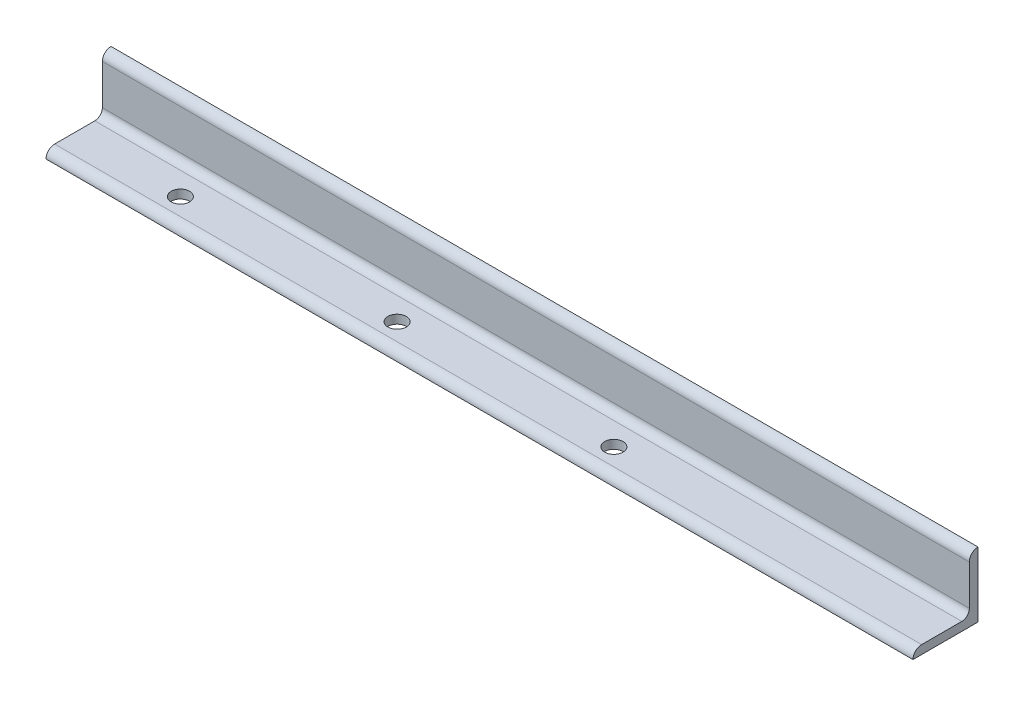
ISO-10303-21;
HEADER;
FILE_DESCRIPTION(('STEP AP214'),'2;1');
FILE_NAME('part.step','',(''),(''),'','','');
FILE_SCHEMA(('AUTOMOTIVE_DESIGN { 1 0 10303 214 1 1 1 1 }'));
ENDSEC;
DATA;
#1=APPLICATION_CONTEXT('core data for automotive mechanical design processes');
#2=APPLICATION_PROTOCOL_DEFINITION('international standard','automotive_design',2000,#1);
#3=PRODUCT_CONTEXT('',#1,'mechanical');
#4=PRODUCT('Part','Part','',(#3));
#5=PRODUCT_RELATED_PRODUCT_CATEGORY('part','',(#4));
#6=PRODUCT_DEFINITION_FORMATION('','',#4);
#7=PRODUCT_DEFINITION_CONTEXT('part definition',#1,'design');
#8=PRODUCT_DEFINITION('design','',#6,#7);
#9=PRODUCT_DEFINITION_SHAPE('','',#8);
#10=(LENGTH_UNIT() NAMED_UNIT(*) SI_UNIT(.MILLI.,.METRE.));
#11=(NAMED_UNIT(*) PLANE_ANGLE_UNIT() SI_UNIT($,.RADIAN.));
#12=(NAMED_UNIT(*) SI_UNIT($,.STERADIAN.) SOLID_ANGLE_UNIT());
#13=UNCERTAINTY_MEASURE_WITH_UNIT(LENGTH_MEASURE(1.E-05),#10,'distance_accuracy_value','');
#14=(GEOMETRIC_REPRESENTATION_CONTEXT(3) GLOBAL_UNCERTAINTY_ASSIGNED_CONTEXT((#13)) GLOBAL_UNIT_ASSIGNED_CONTEXT((#10,
#11,#12)) REPRESENTATION_CONTEXT('',''));
#15=CARTESIAN_POINT('',(0.,0.,0.));
#16=DIRECTION('',(0.,0.,1.));
#17=DIRECTION('',(1.,0.,0.));
#18=AXIS2_PLACEMENT_3D('',#15,#16,#17);
#19=CARTESIAN_POINT('',(400.,30.,0.));
#20=DIRECTION('',(0.,0.,1.));
#21=DIRECTION('',(1.,0.,0.));
#22=AXIS2_PLACEMENT_3D('',#19,#20,#21);
#23=PLANE('',#22);
#24=DIRECTION('',(0.,1.,0.));
#25=VECTOR('',#24,1.);
#26=CARTESIAN_POINT('',(0.,30.,0.));
#27=LINE('',#26,#25);
#28=CARTESIAN_POINT('',(0.,0.,0.));
#29=VERTEX_POINT('',#28);
#30=CARTESIAN_POINT('',(0.,30.,0.));
#31=VERTEX_POINT('',#30);
#32=EDGE_CURVE('E151',#29,#31,#27,.T.);
#33=ORIENTED_EDGE('',*,*,#32,.T.);
#34=DIRECTION('',(-1.,0.,0.));
#35=VECTOR('',#34,1.);
#36=CARTESIAN_POINT('',(400.,30.,0.));
#37=LINE('',#36,#35);
#38=CARTESIAN_POINT('',(400.,30.,0.));
#39=VERTEX_POINT('',#38);
#40=EDGE_CURVE('E13',#39,#31,#37,.T.);
#41=ORIENTED_EDGE('',*,*,#40,.F.);
#42=DIRECTION('',(0.,1.,0.));
#43=VECTOR('',#42,1.);
#44=CARTESIAN_POINT('',(400.,30.,0.));
#45=LINE('',#44,#43);
#46=CARTESIAN_POINT('',(400.,0.,0.));
#47=VERTEX_POINT('',#46);
#48=EDGE_CURVE('E163',#47,#39,#45,.T.);
#49=ORIENTED_EDGE('',*,*,#48,.F.);
#50=DIRECTION('',(-1.,0.,0.));
#51=VECTOR('',#50,1.);
#52=CARTESIAN_POINT('',(400.,0.,0.));
#53=LINE('',#52,#51);
#54=EDGE_CURVE('E147',#47,#29,#53,.T.);
#55=ORIENTED_EDGE('',*,*,#54,.T.);
#56=EDGE_LOOP('',(#33,#41,#49,#55));
#57=FACE_BOUND('',#56,.T.);
#58=ADVANCED_FACE('F59',(#57),#23,.F.);
#59=CARTESIAN_POINT('',(400.,26.,0.));
#60=DIRECTION('',(-1.,0.,0.));
#61=DIRECTION('',(0.,0.,1.));
#62=AXIS2_PLACEMENT_3D('',#59,#60,#61);
#63=CYLINDRICAL_SURFACE('',#62,4.);
#64=CARTESIAN_POINT('',(0.,26.,0.));
#65=DIRECTION('',(1.,0.,0.));
#66=DIRECTION('',(0.,0.,-1.));
#67=AXIS2_PLACEMENT_3D('',#64,#65,#66);
#68=CIRCLE('',#67,4.);
#69=CARTESIAN_POINT('',(0.,26.,4.));
#70=VERTEX_POINT('',#69);
#71=EDGE_CURVE('E154',#31,#70,#68,.T.);
#72=ORIENTED_EDGE('',*,*,#71,.T.);
#73=DIRECTION('',(-1.,0.,0.));
#74=VECTOR('',#73,1.);
#75=CARTESIAN_POINT('',(400.,26.,4.));
#76=LINE('',#75,#74);
#77=CARTESIAN_POINT('',(400.,26.,4.));
#78=VERTEX_POINT('',#77);
#79=EDGE_CURVE('E68',#78,#70,#76,.T.);
#80=ORIENTED_EDGE('',*,*,#79,.F.);
#81=CARTESIAN_POINT('',(400.,26.,0.));
#82=DIRECTION('',(1.,0.,0.));
#83=DIRECTION('',(0.,0.,-1.));
#84=AXIS2_PLACEMENT_3D('',#81,#82,#83);
#85=CIRCLE('',#84,4.);
#86=EDGE_CURVE('E117',#39,#78,#85,.T.);
#87=ORIENTED_EDGE('',*,*,#86,.F.);
#88=ORIENTED_EDGE('',*,*,#40,.T.);
#89=EDGE_LOOP('',(#72,#80,#87,#88));
#90=FACE_BOUND('',#89,.T.);
#91=ADVANCED_FACE('F198',(#90),#63,.T.);
#92=CARTESIAN_POINT('',(400.,7.5,4.));
#93=DIRECTION('',(0.,0.,-1.));
#94=DIRECTION('',(0.,1.,0.));
#95=AXIS2_PLACEMENT_3D('',#92,#93,#94);
#96=PLANE('',#95);
#97=DIRECTION('',(0.,-1.,0.));
#98=VECTOR('',#97,1.);
#99=CARTESIAN_POINT('',(0.,7.5,4.));
#100=LINE('',#99,#98);
#101=CARTESIAN_POINT('',(0.,7.5,4.));
#102=VERTEX_POINT('',#101);
#103=EDGE_CURVE('E156',#70,#102,#100,.T.);
#104=ORIENTED_EDGE('',*,*,#103,.T.);
#105=DIRECTION('',(-1.,0.,0.));
#106=VECTOR('',#105,1.);
#107=CARTESIAN_POINT('',(400.,7.5,4.));
#108=LINE('',#107,#106);
#109=CARTESIAN_POINT('',(400.,7.5,4.));
#110=VERTEX_POINT('',#109);
#111=EDGE_CURVE('E167',#110,#102,#108,.T.);
#112=ORIENTED_EDGE('',*,*,#111,.F.);
#113=DIRECTION('',(0.,-1.,0.));
#114=VECTOR('',#113,1.);
#115=CARTESIAN_POINT('',(400.,7.5,4.));
#116=LINE('',#115,#114);
#117=EDGE_CURVE('E214',#78,#110,#116,.T.);
#118=ORIENTED_EDGE('',*,*,#117,.F.);
#119=ORIENTED_EDGE('',*,*,#79,.T.);
#120=EDGE_LOOP('',(#104,#112,#118,#119));
#121=FACE_BOUND('',#120,.T.);
#122=ADVANCED_FACE('F203',(#121),#96,.F.);
#123=CARTESIAN_POINT('',(400.,7.5,7.5));
#124=DIRECTION('',(-1.,0.,0.));
#125=DIRECTION('',(0.,0.,1.));
#126=AXIS2_PLACEMENT_3D('',#123,#124,#125);
#127=CYLINDRICAL_SURFACE('',#126,3.5);
#128=CARTESIAN_POINT('',(0.,7.5,7.5));
#129=DIRECTION('',(-1.,0.,0.));
#130=DIRECTION('',(0.,0.,1.));
#131=AXIS2_PLACEMENT_3D('',#128,#129,#130);
#132=CIRCLE('',#131,3.5);
#133=CARTESIAN_POINT('',(0.,4.,7.5));
#134=VERTEX_POINT('',#133);
#135=EDGE_CURVE('E158',#102,#134,#132,.T.);
#136=ORIENTED_EDGE('',*,*,#135,.T.);
#137=DIRECTION('',(-1.,0.,0.));
#138=VECTOR('',#137,1.);
#139=CARTESIAN_POINT('',(400.,4.,7.5));
#140=LINE('',#139,#138);
#141=CARTESIAN_POINT('',(400.,4.,7.5));
#142=VERTEX_POINT('',#141);
#143=EDGE_CURVE('E142',#142,#134,#140,.T.);
#144=ORIENTED_EDGE('',*,*,#143,.F.);
#145=CARTESIAN_POINT('',(400.,7.5,7.5));
#146=DIRECTION('',(-1.,0.,0.));
#147=DIRECTION('',(0.,0.,1.));
#148=AXIS2_PLACEMENT_3D('',#145,#146,#147);
#149=CIRCLE('',#148,3.5);
#150=EDGE_CURVE('E133',#110,#142,#149,.T.);
#151=ORIENTED_EDGE('',*,*,#150,.F.);
#152=ORIENTED_EDGE('',*,*,#111,.T.);
#153=EDGE_LOOP('',(#136,#144,#151,#152));
#154=FACE_BOUND('',#153,.T.);
#155=ADVANCED_FACE('F230',(#154),#127,.F.);
#156=CARTESIAN_POINT('',(400.,4.,26.));
#157=DIRECTION('',(0.,-1.,0.));
#158=DIRECTION('',(0.,0.,-1.));
#159=AXIS2_PLACEMENT_3D('',#156,#157,#158);
#160=PLANE('',#159);
#161=CARTESIAN_POINT('',(250.,4.,18.));
#162=DIRECTION('',(0.,1.,0.));
#163=DIRECTION('',(0.,0.,1.));
#164=AXIS2_PLACEMENT_3D('',#161,#162,#163);
#165=CIRCLE('',#164,4.25000000000001);
#166=CARTESIAN_POINT('',(250.,4.,22.25));
#167=VERTEX_POINT('',#166);
#168=EDGE_CURVE('E222',#167,#167,#165,.T.);
#169=ORIENTED_EDGE('',*,*,#168,.F.);
#170=EDGE_LOOP('',(#169));
#171=FACE_BOUND('',#170,.T.);
#172=CARTESIAN_POINT('',(50.,4.,18.));
#173=DIRECTION('',(0.,1.,0.));
#174=DIRECTION('',(0.,0.,1.));
#175=AXIS2_PLACEMENT_3D('',#172,#173,#174);
#176=CIRCLE('',#175,4.25);
#177=CARTESIAN_POINT('',(50.,4.,22.25));
#178=VERTEX_POINT('',#177);
#179=EDGE_CURVE('E221',#178,#178,#176,.T.);
#180=ORIENTED_EDGE('',*,*,#179,.F.);
#181=EDGE_LOOP('',(#180));
#182=FACE_BOUND('',#181,.T.);
#183=CARTESIAN_POINT('',(150.,4.,18.));
#184=DIRECTION('',(0.,1.,0.));
#185=DIRECTION('',(0.,0.,1.));
#186=AXIS2_PLACEMENT_3D('',#183,#184,#185);
#187=CIRCLE('',#186,4.25);
#188=CARTESIAN_POINT('',(150.,4.,22.25));
#189=VERTEX_POINT('',#188);
#190=EDGE_CURVE('E175',#189,#189,#187,.T.);
#191=ORIENTED_EDGE('',*,*,#190,.F.);
#192=EDGE_LOOP('',(#191));
#193=FACE_BOUND('',#192,.T.);
#194=DIRECTION('',(0.,0.,1.));
#195=VECTOR('',#194,1.);
#196=CARTESIAN_POINT('',(0.,4.,26.));
#197=LINE('',#196,#195);
#198=CARTESIAN_POINT('',(0.,4.,26.));
#199=VERTEX_POINT('',#198);
#200=EDGE_CURVE('E141',#134,#199,#197,.T.);
#201=ORIENTED_EDGE('',*,*,#200,.T.);
#202=DIRECTION('',(-1.,0.,0.));
#203=VECTOR('',#202,1.);
#204=CARTESIAN_POINT('',(400.,4.,26.));
#205=LINE('',#204,#203);
#206=CARTESIAN_POINT('',(400.,4.,26.));
#207=VERTEX_POINT('',#206);
#208=EDGE_CURVE('E138',#207,#199,#205,.T.);
#209=ORIENTED_EDGE('',*,*,#208,.F.);
#210=DIRECTION('',(0.,0.,1.));
#211=VECTOR('',#210,1.);
#212=CARTESIAN_POINT('',(400.,4.,26.));
#213=LINE('',#212,#211);
#214=EDGE_CURVE('E127',#142,#207,#213,.T.);
#215=ORIENTED_EDGE('',*,*,#214,.F.);
#216=ORIENTED_EDGE('',*,*,#143,.T.);
#217=EDGE_LOOP('',(#201,#209,#215,#216));
#218=FACE_BOUND('',#217,.T.);
#219=ADVANCED_FACE('F139',(#171,#182,#193,#218),#160,.F.);
#220=CARTESIAN_POINT('',(400.,0.,26.));
#221=DIRECTION('',(-1.,0.,0.));
#222=DIRECTION('',(0.,0.,1.));
#223=AXIS2_PLACEMENT_3D('',#220,#221,#222);
#224=CYLINDRICAL_SURFACE('',#223,4.);
#225=CARTESIAN_POINT('',(0.,0.,26.));
#226=DIRECTION('',(1.,0.,0.));
#227=DIRECTION('',(0.,0.,1.));
#228=AXIS2_PLACEMENT_3D('',#225,#226,#227);
#229=CIRCLE('',#228,4.);
#230=CARTESIAN_POINT('',(0.,0.,30.));
#231=VERTEX_POINT('',#230);
#232=EDGE_CURVE('E103',#199,#231,#229,.T.);
#233=ORIENTED_EDGE('',*,*,#232,.T.);
#234=DIRECTION('',(-1.,0.,0.));
#235=VECTOR('',#234,1.);
#236=CARTESIAN_POINT('',(400.,0.,30.));
#237=LINE('',#236,#235);
#238=CARTESIAN_POINT('',(400.,0.,30.));
#239=VERTEX_POINT('',#238);
#240=EDGE_CURVE('E143',#239,#231,#237,.T.);
#241=ORIENTED_EDGE('',*,*,#240,.F.);
#242=CARTESIAN_POINT('',(400.,0.,26.));
#243=DIRECTION('',(1.,0.,0.));
#244=DIRECTION('',(0.,0.,1.));
#245=AXIS2_PLACEMENT_3D('',#242,#243,#244);
#246=CIRCLE('',#245,4.);
#247=EDGE_CURVE('E131',#207,#239,#246,.T.);
#248=ORIENTED_EDGE('',*,*,#247,.F.);
#249=ORIENTED_EDGE('',*,*,#208,.T.);
#250=EDGE_LOOP('',(#233,#241,#248,#249));
#251=FACE_BOUND('',#250,.T.);
#252=ADVANCED_FACE('F145',(#251),#224,.T.);
#253=CARTESIAN_POINT('',(400.,0.,0.));
#254=DIRECTION('',(0.,1.,0.));
#255=DIRECTION('',(0.,0.,1.));
#256=AXIS2_PLACEMENT_3D('',#253,#254,#255);
#257=PLANE('',#256);
#258=CARTESIAN_POINT('',(250.,0.,18.));
#259=DIRECTION('',(0.,1.,0.));
#260=DIRECTION('',(0.,0.,1.));
#261=AXIS2_PLACEMENT_3D('',#258,#259,#260);
#262=CIRCLE('',#261,4.25000000000001);
#263=CARTESIAN_POINT('',(250.,0.,22.25));
#264=VERTEX_POINT('',#263);
#265=EDGE_CURVE('E62',#264,#264,#262,.T.);
#266=ORIENTED_EDGE('',*,*,#265,.T.);
#267=EDGE_LOOP('',(#266));
#268=FACE_BOUND('',#267,.T.);
#269=CARTESIAN_POINT('',(50.,0.,18.));
#270=DIRECTION('',(0.,1.,0.));
#271=DIRECTION('',(0.,0.,1.));
#272=AXIS2_PLACEMENT_3D('',#269,#270,#271);
#273=CIRCLE('',#272,4.25);
#274=CARTESIAN_POINT('',(50.,0.,22.25));
#275=VERTEX_POINT('',#274);
#276=EDGE_CURVE('E174',#275,#275,#273,.T.);
#277=ORIENTED_EDGE('',*,*,#276,.T.);
#278=EDGE_LOOP('',(#277));
#279=FACE_BOUND('',#278,.T.);
#280=CARTESIAN_POINT('',(150.,0.,18.));
#281=DIRECTION('',(0.,1.,0.));
#282=DIRECTION('',(0.,0.,1.));
#283=AXIS2_PLACEMENT_3D('',#280,#281,#282);
#284=CIRCLE('',#283,4.25);
#285=CARTESIAN_POINT('',(150.,0.,22.25));
#286=VERTEX_POINT('',#285);
#287=EDGE_CURVE('E172',#286,#286,#284,.T.);
#288=ORIENTED_EDGE('',*,*,#287,.T.);
#289=EDGE_LOOP('',(#288));
#290=FACE_BOUND('',#289,.T.);
#291=DIRECTION('',(0.,0.,-1.));
#292=VECTOR('',#291,1.);
#293=CARTESIAN_POINT('',(0.,0.,0.));
#294=LINE('',#293,#292);
#295=EDGE_CURVE('E109',#231,#29,#294,.T.);
#296=ORIENTED_EDGE('',*,*,#295,.T.);
#297=ORIENTED_EDGE('',*,*,#54,.F.);
#298=DIRECTION('',(0.,0.,-1.));
#299=VECTOR('',#298,1.);
#300=CARTESIAN_POINT('',(400.,0.,0.));
#301=LINE('',#300,#299);
#302=EDGE_CURVE('E77',#239,#47,#301,.T.);
#303=ORIENTED_EDGE('',*,*,#302,.F.);
#304=ORIENTED_EDGE('',*,*,#240,.T.);
#305=EDGE_LOOP('',(#296,#297,#303,#304));
#306=FACE_BOUND('',#305,.T.);
#307=ADVANCED_FACE('F182',(#268,#279,#290,#306),#257,.F.);
#308=CARTESIAN_POINT('',(400.,0.,26.));
#309=DIRECTION('',(-1.,0.,0.));
#310=DIRECTION('',(0.,0.,1.));
#311=AXIS2_PLACEMENT_3D('',#308,#309,#310);
#312=PLANE('',#311);
#313=ORIENTED_EDGE('',*,*,#48,.T.);
#314=ORIENTED_EDGE('',*,*,#86,.T.);
#315=ORIENTED_EDGE('',*,*,#117,.T.);
#316=ORIENTED_EDGE('',*,*,#150,.T.);
#317=ORIENTED_EDGE('',*,*,#214,.T.);
#318=ORIENTED_EDGE('',*,*,#247,.T.);
#319=ORIENTED_EDGE('',*,*,#302,.T.);
#320=EDGE_LOOP('',(#313,#314,#315,#316,#317,#318,#319));
#321=FACE_BOUND('',#320,.T.);
#322=ADVANCED_FACE('F129',(#321),#312,.F.);
#323=CARTESIAN_POINT('',(0.,0.,26.));
#324=DIRECTION('',(-1.,0.,0.));
#325=DIRECTION('',(0.,0.,1.));
#326=AXIS2_PLACEMENT_3D('',#323,#324,#325);
#327=PLANE('',#326);
#328=ORIENTED_EDGE('',*,*,#32,.F.);
#329=ORIENTED_EDGE('',*,*,#295,.F.);
#330=ORIENTED_EDGE('',*,*,#232,.F.);
#331=ORIENTED_EDGE('',*,*,#200,.F.);
#332=ORIENTED_EDGE('',*,*,#135,.F.);
#333=ORIENTED_EDGE('',*,*,#103,.F.);
#334=ORIENTED_EDGE('',*,*,#71,.F.);
#335=EDGE_LOOP('',(#328,#329,#330,#331,#332,#333,#334));
#336=FACE_BOUND('',#335,.T.);
#337=ADVANCED_FACE('F208',(#336),#327,.T.);
#338=CARTESIAN_POINT('',(150.,-6.,18.));
#339=DIRECTION('',(0.,1.,0.));
#340=DIRECTION('',(0.,0.,1.));
#341=AXIS2_PLACEMENT_3D('',#338,#339,#340);
#342=CYLINDRICAL_SURFACE('',#341,4.25);
#343=ORIENTED_EDGE('',*,*,#190,.T.);
#344=EDGE_LOOP('',(#343));
#345=FACE_BOUND('',#344,.T.);
#346=ORIENTED_EDGE('',*,*,#287,.F.);
#347=EDGE_LOOP('',(#346));
#348=FACE_BOUND('',#347,.T.);
#349=ADVANCED_FACE('F192',(#345,#348),#342,.F.);
#350=CARTESIAN_POINT('',(50.,-6.,18.));
#351=DIRECTION('',(0.,1.,0.));
#352=DIRECTION('',(0.,0.,1.));
#353=AXIS2_PLACEMENT_3D('',#350,#351,#352);
#354=CYLINDRICAL_SURFACE('',#353,4.25);
#355=ORIENTED_EDGE('',*,*,#179,.T.);
#356=EDGE_LOOP('',(#355));
#357=FACE_BOUND('',#356,.T.);
#358=ORIENTED_EDGE('',*,*,#276,.F.);
#359=EDGE_LOOP('',(#358));
#360=FACE_BOUND('',#359,.T.);
#361=ADVANCED_FACE('F186',(#357,#360),#354,.F.);
#362=CARTESIAN_POINT('',(250.,-6.,18.));
#363=DIRECTION('',(0.,1.,0.));
#364=DIRECTION('',(0.,0.,1.));
#365=AXIS2_PLACEMENT_3D('',#362,#363,#364);
#366=CYLINDRICAL_SURFACE('',#365,4.25000000000001);
#367=ORIENTED_EDGE('',*,*,#168,.T.);
#368=EDGE_LOOP('',(#367));
#369=FACE_BOUND('',#368,.T.);
#370=ORIENTED_EDGE('',*,*,#265,.F.);
#371=EDGE_LOOP('',(#370));
#372=FACE_BOUND('',#371,.T.);
#373=ADVANCED_FACE('F184',(#369,#372),#366,.F.);
#374=CLOSED_SHELL('',(#58,#91,#122,#155,#219,#252,#307,#322,#337,#349,#361,#373));
#375=MANIFOLD_SOLID_BREP('B2',#374);
#376=ADVANCED_BREP_SHAPE_REPRESENTATION('',(#18,#375),#14);
#377=SHAPE_DEFINITION_REPRESENTATION(#9,#376);
ENDSEC;
END-ISO-10303-21;
